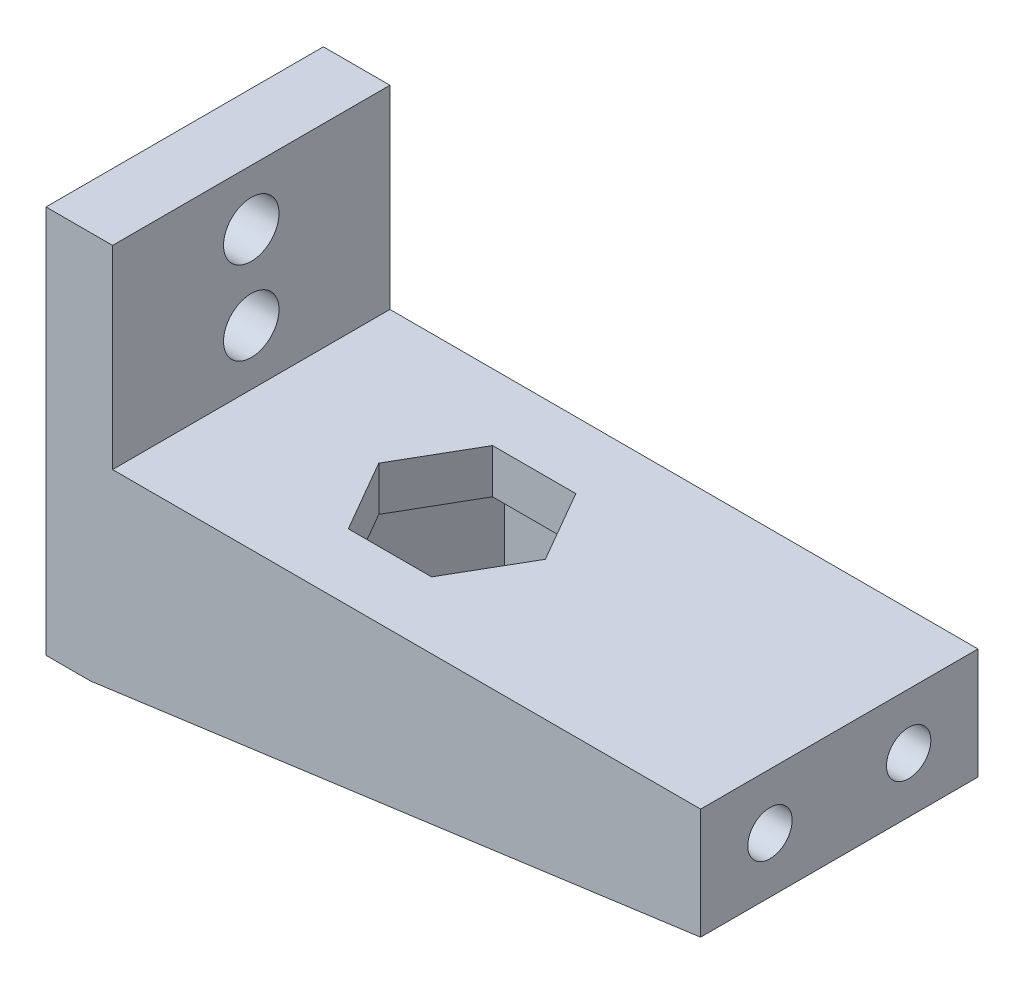
ISO-10303-21;
HEADER;
FILE_DESCRIPTION(('STEP AP214'),'2;1');
FILE_NAME('part.step','',(''),(''),'','','');
FILE_SCHEMA(('AUTOMOTIVE_DESIGN { 1 0 10303 214 1 1 1 1 }'));
ENDSEC;
DATA;
#1=APPLICATION_CONTEXT('core data for automotive mechanical design processes');
#2=APPLICATION_PROTOCOL_DEFINITION('international standard','automotive_design',2000,#1);
#3=PRODUCT_CONTEXT('',#1,'mechanical');
#4=PRODUCT('Part','Part','',(#3));
#5=PRODUCT_RELATED_PRODUCT_CATEGORY('part','',(#4));
#6=PRODUCT_DEFINITION_FORMATION('','',#4);
#7=PRODUCT_DEFINITION_CONTEXT('part definition',#1,'design');
#8=PRODUCT_DEFINITION('design','',#6,#7);
#9=PRODUCT_DEFINITION_SHAPE('','',#8);
#10=(LENGTH_UNIT() NAMED_UNIT(*) SI_UNIT(.MILLI.,.METRE.));
#11=(NAMED_UNIT(*) PLANE_ANGLE_UNIT() SI_UNIT($,.RADIAN.));
#12=(NAMED_UNIT(*) SI_UNIT($,.STERADIAN.) SOLID_ANGLE_UNIT());
#13=UNCERTAINTY_MEASURE_WITH_UNIT(LENGTH_MEASURE(1.E-05),#10,'distance_accuracy_value','');
#14=(GEOMETRIC_REPRESENTATION_CONTEXT(3) GLOBAL_UNCERTAINTY_ASSIGNED_CONTEXT((#13)) GLOBAL_UNIT_ASSIGNED_CONTEXT((#10,
#11,#12)) REPRESENTATION_CONTEXT('',''));
#15=CARTESIAN_POINT('',(0.,0.,0.));
#16=DIRECTION('',(0.,0.,1.));
#17=DIRECTION('',(1.,0.,0.));
#18=AXIS2_PLACEMENT_3D('',#15,#16,#17);
#19=CARTESIAN_POINT('',(4.,20.3125,8.17307692307693));
#20=DIRECTION('',(0.,0.,-1.));
#21=DIRECTION('',(0.,1.,0.));
#22=AXIS2_PLACEMENT_3D('',#19,#20,#21);
#23=PLANE('',#22);
#24=DIRECTION('',(-1.,0.,0.));
#25=VECTOR('',#24,1.);
#26=CARTESIAN_POINT('',(4.,-14.6875,8.17307692307692));
#27=LINE('',#26,#25);
#28=CARTESIAN_POINT('',(4.,-14.6875,8.17307692307693));
#29=VERTEX_POINT('',#28);
#30=CARTESIAN_POINT('',(0.,-14.6875,8.17307692307692));
#31=VERTEX_POINT('',#30);
#32=EDGE_CURVE('E319',#29,#31,#27,.T.);
#33=ORIENTED_EDGE('',*,*,#32,.F.);
#34=DIRECTION('',(0.990830168044299,0.135113204733314,0.));
#35=VECTOR('',#34,1.);
#36=CARTESIAN_POINT('',(4.,-14.6875,8.17307692307693));
#37=LINE('',#36,#35);
#38=CARTESIAN_POINT('',(59.,-7.1875,8.17307692307693));
#39=VERTEX_POINT('',#38);
#40=EDGE_CURVE('E246',#29,#39,#37,.T.);
#41=ORIENTED_EDGE('',*,*,#40,.T.);
#42=DIRECTION('',(0.,-1.,0.));
#43=VECTOR('',#42,1.);
#44=CARTESIAN_POINT('',(59.,2.8125,8.17307692307693));
#45=LINE('',#44,#43);
#46=CARTESIAN_POINT('',(59.,2.8125,8.17307692307693));
#47=VERTEX_POINT('',#46);
#48=EDGE_CURVE('E272',#47,#39,#45,.T.);
#49=ORIENTED_EDGE('',*,*,#48,.F.);
#50=DIRECTION('',(-1.,0.,0.));
#51=VECTOR('',#50,1.);
#52=CARTESIAN_POINT('',(59.,2.8125,8.17307692307693));
#53=LINE('',#52,#51);
#54=CARTESIAN_POINT('',(6.,2.8125,8.17307692307693));
#55=VERTEX_POINT('',#54);
#56=EDGE_CURVE('E282',#47,#55,#53,.T.);
#57=ORIENTED_EDGE('',*,*,#56,.T.);
#58=DIRECTION('',(0.,-1.,0.));
#59=VECTOR('',#58,1.);
#60=CARTESIAN_POINT('',(6.,20.3125,8.17307692307693));
#61=LINE('',#60,#59);
#62=CARTESIAN_POINT('',(6.,20.3125,8.17307692307693));
#63=VERTEX_POINT('',#62);
#64=EDGE_CURVE('E287',#63,#55,#61,.T.);
#65=ORIENTED_EDGE('',*,*,#64,.F.);
#66=DIRECTION('',(-1.,0.,0.));
#67=VECTOR('',#66,1.);
#68=CARTESIAN_POINT('',(4.,20.3125,8.17307692307693));
#69=LINE('',#68,#67);
#70=CARTESIAN_POINT('',(0.,20.3125,8.17307692307693));
#71=VERTEX_POINT('',#70);
#72=EDGE_CURVE('E302',#63,#71,#69,.T.);
#73=ORIENTED_EDGE('',*,*,#72,.T.);
#74=DIRECTION('',(0.,-1.,0.));
#75=VECTOR('',#74,1.);
#76=CARTESIAN_POINT('',(0.,20.3125,8.17307692307693));
#77=LINE('',#76,#75);
#78=EDGE_CURVE('E299',#71,#31,#77,.T.);
#79=ORIENTED_EDGE('',*,*,#78,.T.);
#80=EDGE_LOOP('',(#33,#41,#49,#57,#65,#73,#79));
#81=FACE_BOUND('',#80,.T.);
#82=ADVANCED_FACE('F32',(#81),#23,.F.);
#83=CARTESIAN_POINT('',(4.,-14.6875,8.17307692307692));
#84=DIRECTION('',(0.,1.,0.));
#85=DIRECTION('',(0.,0.,1.));
#86=AXIS2_PLACEMENT_3D('',#83,#84,#85);
#87=PLANE('',#86);
#88=DIRECTION('',(0.,0.,-1.));
#89=VECTOR('',#88,1.);
#90=CARTESIAN_POINT('',(0.,-14.6875,8.17307692307692));
#91=LINE('',#90,#89);
#92=CARTESIAN_POINT('',(0.,-14.6875,-16.8269230769231));
#93=VERTEX_POINT('',#92);
#94=EDGE_CURVE('E306',#31,#93,#91,.T.);
#95=ORIENTED_EDGE('',*,*,#94,.T.);
#96=DIRECTION('',(-1.,0.,0.));
#97=VECTOR('',#96,1.);
#98=CARTESIAN_POINT('',(4.,-14.6875,-16.8269230769231));
#99=LINE('',#98,#97);
#100=CARTESIAN_POINT('',(4.,-14.6875,-16.8269230769231));
#101=VERTEX_POINT('',#100);
#102=EDGE_CURVE('E316',#101,#93,#99,.T.);
#103=ORIENTED_EDGE('',*,*,#102,.F.);
#104=DIRECTION('',(0.,0.,-1.));
#105=VECTOR('',#104,1.);
#106=CARTESIAN_POINT('',(4.,-14.6875,8.17307692307692));
#107=LINE('',#106,#105);
#108=EDGE_CURVE('E300',#29,#101,#107,.T.);
#109=ORIENTED_EDGE('',*,*,#108,.F.);
#110=ORIENTED_EDGE('',*,*,#32,.T.);
#111=EDGE_LOOP('',(#95,#103,#109,#110));
#112=FACE_BOUND('',#111,.T.);
#113=ADVANCED_FACE('F356',(#112),#87,.F.);
#114=CARTESIAN_POINT('',(4.,20.3125,-16.8269230769231));
#115=DIRECTION('',(0.,0.,1.));
#116=DIRECTION('',(1.,0.,0.));
#117=AXIS2_PLACEMENT_3D('',#114,#115,#116);
#118=PLANE('',#117);
#119=DIRECTION('',(0.,1.,0.));
#120=VECTOR('',#119,1.);
#121=CARTESIAN_POINT('',(0.,20.3125,-16.8269230769231));
#122=LINE('',#121,#120);
#123=CARTESIAN_POINT('',(0.,20.3125,-16.8269230769231));
#124=VERTEX_POINT('',#123);
#125=EDGE_CURVE('E308',#93,#124,#122,.T.);
#126=ORIENTED_EDGE('',*,*,#125,.T.);
#127=DIRECTION('',(-1.,0.,0.));
#128=VECTOR('',#127,1.);
#129=CARTESIAN_POINT('',(4.,20.3125,-16.8269230769231));
#130=LINE('',#129,#128);
#131=CARTESIAN_POINT('',(6.,20.3125,-16.8269230769231));
#132=VERTEX_POINT('',#131);
#133=EDGE_CURVE('E313',#132,#124,#130,.T.);
#134=ORIENTED_EDGE('',*,*,#133,.F.);
#135=DIRECTION('',(0.,1.,0.));
#136=VECTOR('',#135,1.);
#137=CARTESIAN_POINT('',(6.,20.3125,-16.8269230769231));
#138=LINE('',#137,#136);
#139=CARTESIAN_POINT('',(6.,2.8125,-16.8269230769231));
#140=VERTEX_POINT('',#139);
#141=EDGE_CURVE('E293',#140,#132,#138,.T.);
#142=ORIENTED_EDGE('',*,*,#141,.F.);
#143=DIRECTION('',(-1.,0.,0.));
#144=VECTOR('',#143,1.);
#145=CARTESIAN_POINT('',(59.,2.8125,-16.8269230769231));
#146=LINE('',#145,#144);
#147=CARTESIAN_POINT('',(59.,2.8125,-16.8269230769231));
#148=VERTEX_POINT('',#147);
#149=EDGE_CURVE('E285',#148,#140,#146,.T.);
#150=ORIENTED_EDGE('',*,*,#149,.F.);
#151=DIRECTION('',(0.,1.,0.));
#152=VECTOR('',#151,1.);
#153=CARTESIAN_POINT('',(59.,2.8125,-16.8269230769231));
#154=LINE('',#153,#152);
#155=CARTESIAN_POINT('',(59.,-7.1875,-16.8269230769231));
#156=VERTEX_POINT('',#155);
#157=EDGE_CURVE('E278',#156,#148,#154,.T.);
#158=ORIENTED_EDGE('',*,*,#157,.F.);
#159=DIRECTION('',(0.990830168044299,0.135113204733314,0.));
#160=VECTOR('',#159,1.);
#161=CARTESIAN_POINT('',(4.,-14.6875,-16.8269230769231));
#162=LINE('',#161,#160);
#163=EDGE_CURVE('E256',#101,#156,#162,.T.);
#164=ORIENTED_EDGE('',*,*,#163,.F.);
#165=ORIENTED_EDGE('',*,*,#102,.T.);
#166=EDGE_LOOP('',(#126,#134,#142,#150,#158,#164,#165));
#167=FACE_BOUND('',#166,.T.);
#168=ADVANCED_FACE('F361',(#167),#118,.F.);
#169=CARTESIAN_POINT('',(4.,20.3125,8.17307692307693));
#170=DIRECTION('',(0.,-1.,0.));
#171=DIRECTION('',(0.,0.,-1.));
#172=AXIS2_PLACEMENT_3D('',#169,#170,#171);
#173=PLANE('',#172);
#174=DIRECTION('',(0.,0.,1.));
#175=VECTOR('',#174,1.);
#176=CARTESIAN_POINT('',(0.,20.3125,8.17307692307693));
#177=LINE('',#176,#175);
#178=EDGE_CURVE('E303',#124,#71,#177,.T.);
#179=ORIENTED_EDGE('',*,*,#178,.T.);
#180=ORIENTED_EDGE('',*,*,#72,.F.);
#181=DIRECTION('',(0.,0.,1.));
#182=VECTOR('',#181,1.);
#183=CARTESIAN_POINT('',(6.,20.3125,8.17307692307693));
#184=LINE('',#183,#182);
#185=EDGE_CURVE('E296',#132,#63,#184,.T.);
#186=ORIENTED_EDGE('',*,*,#185,.F.);
#187=ORIENTED_EDGE('',*,*,#133,.T.);
#188=EDGE_LOOP('',(#179,#180,#186,#187));
#189=FACE_BOUND('',#188,.T.);
#190=ADVANCED_FACE('F384',(#189),#173,.F.);
#191=CARTESIAN_POINT('',(0.,0.,0.));
#192=DIRECTION('',(1.,0.,0.));
#193=DIRECTION('',(0.,0.,-1.));
#194=AXIS2_PLACEMENT_3D('',#191,#192,#193);
#195=PLANE('',#194);
#196=CARTESIAN_POINT('',(0.,15.3125,-4.32692307692307));
#197=DIRECTION('',(1.,0.,0.));
#198=DIRECTION('',(0.,0.,-1.));
#199=AXIS2_PLACEMENT_3D('',#196,#197,#198);
#200=CIRCLE('',#199,2.5);
#201=CARTESIAN_POINT('',(0.,15.3125,-6.82692307692307));
#202=VERTEX_POINT('',#201);
#203=EDGE_CURVE('E269',#202,#202,#200,.T.);
#204=ORIENTED_EDGE('',*,*,#203,.T.);
#205=EDGE_LOOP('',(#204));
#206=FACE_BOUND('',#205,.T.);
#207=CARTESIAN_POINT('',(0.,7.8125,-4.32692307692307));
#208=DIRECTION('',(1.,0.,0.));
#209=DIRECTION('',(0.,0.,-1.));
#210=AXIS2_PLACEMENT_3D('',#207,#208,#209);
#211=CIRCLE('',#210,2.5);
#212=CARTESIAN_POINT('',(0.,7.8125,-6.82692307692307));
#213=VERTEX_POINT('',#212);
#214=EDGE_CURVE('E264',#213,#213,#211,.T.);
#215=ORIENTED_EDGE('',*,*,#214,.T.);
#216=EDGE_LOOP('',(#215));
#217=FACE_BOUND('',#216,.T.);
#218=ORIENTED_EDGE('',*,*,#78,.F.);
#219=ORIENTED_EDGE('',*,*,#178,.F.);
#220=ORIENTED_EDGE('',*,*,#125,.F.);
#221=ORIENTED_EDGE('',*,*,#94,.F.);
#222=EDGE_LOOP('',(#218,#219,#220,#221));
#223=FACE_BOUND('',#222,.T.);
#224=ADVANCED_FACE('F387',(#206,#217,#223),#195,.F.);
#225=CARTESIAN_POINT('',(6.,0.,0.));
#226=DIRECTION('',(1.,0.,0.));
#227=DIRECTION('',(0.,0.,-1.));
#228=AXIS2_PLACEMENT_3D('',#225,#226,#227);
#229=PLANE('',#228);
#230=CARTESIAN_POINT('',(6.,15.3125,-4.32692307692307));
#231=DIRECTION('',(1.,0.,0.));
#232=DIRECTION('',(0.,0.,-1.));
#233=AXIS2_PLACEMENT_3D('',#230,#231,#232);
#234=CIRCLE('',#233,2.5);
#235=CARTESIAN_POINT('',(6.,15.3125,-6.82692307692307));
#236=VERTEX_POINT('',#235);
#237=EDGE_CURVE('E261',#236,#236,#234,.T.);
#238=ORIENTED_EDGE('',*,*,#237,.F.);
#239=EDGE_LOOP('',(#238));
#240=FACE_BOUND('',#239,.T.);
#241=CARTESIAN_POINT('',(6.,7.8125,-4.32692307692307));
#242=DIRECTION('',(1.,0.,0.));
#243=DIRECTION('',(0.,0.,-1.));
#244=AXIS2_PLACEMENT_3D('',#241,#242,#243);
#245=CIRCLE('',#244,2.5);
#246=CARTESIAN_POINT('',(6.,7.8125,-6.82692307692307));
#247=VERTEX_POINT('',#246);
#248=EDGE_CURVE('E258',#247,#247,#245,.T.);
#249=ORIENTED_EDGE('',*,*,#248,.F.);
#250=EDGE_LOOP('',(#249));
#251=FACE_BOUND('',#250,.T.);
#252=ORIENTED_EDGE('',*,*,#64,.T.);
#253=DIRECTION('',(0.,0.,-1.));
#254=VECTOR('',#253,1.);
#255=CARTESIAN_POINT('',(6.,2.8125,8.17307692307693));
#256=LINE('',#255,#254);
#257=EDGE_CURVE('E290',#55,#140,#256,.T.);
#258=ORIENTED_EDGE('',*,*,#257,.T.);
#259=ORIENTED_EDGE('',*,*,#141,.T.);
#260=ORIENTED_EDGE('',*,*,#185,.T.);
#261=EDGE_LOOP('',(#252,#258,#259,#260));
#262=FACE_BOUND('',#261,.T.);
#263=ADVANCED_FACE('F381',(#240,#251,#262),#229,.T.);
#264=CARTESIAN_POINT('',(59.,2.8125,8.17307692307693));
#265=DIRECTION('',(0.,-1.,0.));
#266=DIRECTION('',(0.,0.,-1.));
#267=AXIS2_PLACEMENT_3D('',#264,#265,#266);
#268=PLANE('',#267);
#269=DIRECTION('',(-0.5,0.,-0.866025403784439));
#270=VECTOR('',#269,1.);
#271=CARTESIAN_POINT('',(32.5055534994651,2.8125,-4.32692307692308));
#272=LINE('',#271,#270);
#273=CARTESIAN_POINT('',(32.5055534994651,2.8125,-4.32692307692309));
#274=VERTEX_POINT('',#273);
#275=CARTESIAN_POINT('',(28.7527767497326,2.8125,-10.8269230769231));
#276=VERTEX_POINT('',#275);
#277=EDGE_CURVE('E230',#274,#276,#272,.T.);
#278=ORIENTED_EDGE('',*,*,#277,.F.);
#279=DIRECTION('',(0.5,0.,-0.866025403784439));
#280=VECTOR('',#279,1.);
#281=CARTESIAN_POINT('',(28.7527767497326,2.8125,2.17307692307693));
#282=LINE('',#281,#280);
#283=CARTESIAN_POINT('',(28.7527767497326,2.8125,2.17307692307693));
#284=VERTEX_POINT('',#283);
#285=EDGE_CURVE('E54',#284,#274,#282,.T.);
#286=ORIENTED_EDGE('',*,*,#285,.F.);
#287=DIRECTION('',(1.,0.,0.));
#288=VECTOR('',#287,1.);
#289=CARTESIAN_POINT('',(21.2472232502674,2.8125,2.17307692307693));
#290=LINE('',#289,#288);
#291=CARTESIAN_POINT('',(21.2472232502674,2.8125,2.17307692307693));
#292=VERTEX_POINT('',#291);
#293=EDGE_CURVE('E218',#292,#284,#290,.T.);
#294=ORIENTED_EDGE('',*,*,#293,.F.);
#295=DIRECTION('',(0.5,0.,0.866025403784439));
#296=VECTOR('',#295,1.);
#297=CARTESIAN_POINT('',(17.4944465005349,2.8125,-4.32692307692307));
#298=LINE('',#297,#296);
#299=CARTESIAN_POINT('',(17.4944465005349,2.8125,-4.32692307692307));
#300=VERTEX_POINT('',#299);
#301=EDGE_CURVE('E239',#300,#292,#298,.T.);
#302=ORIENTED_EDGE('',*,*,#301,.F.);
#303=DIRECTION('',(-0.5,0.,0.866025403784438));
#304=VECTOR('',#303,1.);
#305=CARTESIAN_POINT('',(21.2472232502674,2.8125,-10.8269230769231));
#306=LINE('',#305,#304);
#307=CARTESIAN_POINT('',(21.2472232502674,2.8125,-10.8269230769231));
#308=VERTEX_POINT('',#307);
#309=EDGE_CURVE('E236',#308,#300,#306,.T.);
#310=ORIENTED_EDGE('',*,*,#309,.F.);
#311=DIRECTION('',(-1.,0.,0.));
#312=VECTOR('',#311,1.);
#313=CARTESIAN_POINT('',(28.7527767497326,2.8125,-10.8269230769231));
#314=LINE('',#313,#312);
#315=EDGE_CURVE('E233',#276,#308,#314,.T.);
#316=ORIENTED_EDGE('',*,*,#315,.F.);
#317=EDGE_LOOP('',(#278,#286,#294,#302,#310,#316));
#318=FACE_BOUND('',#317,.T.);
#319=ORIENTED_EDGE('',*,*,#257,.F.);
#320=ORIENTED_EDGE('',*,*,#56,.F.);
#321=DIRECTION('',(0.,0.,1.));
#322=VECTOR('',#321,1.);
#323=CARTESIAN_POINT('',(59.,2.8125,8.17307692307693));
#324=LINE('',#323,#322);
#325=EDGE_CURVE('E280',#148,#47,#324,.T.);
#326=ORIENTED_EDGE('',*,*,#325,.F.);
#327=ORIENTED_EDGE('',*,*,#149,.T.);
#328=EDGE_LOOP('',(#319,#320,#326,#327));
#329=FACE_BOUND('',#328,.T.);
#330=ADVANCED_FACE('F395',(#318,#329),#268,.F.);
#331=CARTESIAN_POINT('',(59.,0.,0.));
#332=DIRECTION('',(1.,0.,0.));
#333=DIRECTION('',(0.,0.,-1.));
#334=AXIS2_PLACEMENT_3D('',#331,#332,#333);
#335=PLANE('',#334);
#336=CARTESIAN_POINT('',(59.,-2.1875,1.92307692307692));
#337=DIRECTION('',(1.,0.,0.));
#338=DIRECTION('',(0.,0.,-1.));
#339=AXIS2_PLACEMENT_3D('',#336,#337,#338);
#340=CIRCLE('',#339,2.);
#341=CARTESIAN_POINT('',(59.,-2.1875,-0.0769230769230751));
#342=VERTEX_POINT('',#341);
#343=EDGE_CURVE('E207',#342,#342,#340,.T.);
#344=ORIENTED_EDGE('',*,*,#343,.F.);
#345=EDGE_LOOP('',(#344));
#346=FACE_BOUND('',#345,.T.);
#347=CARTESIAN_POINT('',(59.,-2.1875,-10.5769230769231));
#348=DIRECTION('',(1.,0.,0.));
#349=DIRECTION('',(0.,0.,-1.));
#350=AXIS2_PLACEMENT_3D('',#347,#348,#349);
#351=CIRCLE('',#350,2.);
#352=CARTESIAN_POINT('',(59.,-2.1875,-12.5769230769231));
#353=VERTEX_POINT('',#352);
#354=EDGE_CURVE('E196',#353,#353,#351,.T.);
#355=ORIENTED_EDGE('',*,*,#354,.F.);
#356=EDGE_LOOP('',(#355));
#357=FACE_BOUND('',#356,.T.);
#358=ORIENTED_EDGE('',*,*,#48,.T.);
#359=DIRECTION('',(0.,0.,-1.));
#360=VECTOR('',#359,1.);
#361=CARTESIAN_POINT('',(59.,-7.1875,8.17307692307693));
#362=LINE('',#361,#360);
#363=EDGE_CURVE('E275',#39,#156,#362,.T.);
#364=ORIENTED_EDGE('',*,*,#363,.T.);
#365=ORIENTED_EDGE('',*,*,#157,.T.);
#366=ORIENTED_EDGE('',*,*,#325,.T.);
#367=EDGE_LOOP('',(#358,#364,#365,#366));
#368=FACE_BOUND('',#367,.T.);
#369=ADVANCED_FACE('F376',(#346,#357,#368),#335,.T.);
#370=CARTESIAN_POINT('',(-49.,7.8125,-4.32692307692307));
#371=DIRECTION('',(1.,0.,0.));
#372=DIRECTION('',(0.,0.,-1.));
#373=AXIS2_PLACEMENT_3D('',#370,#371,#372);
#374=CYLINDRICAL_SURFACE('',#373,2.5);
#375=ORIENTED_EDGE('',*,*,#248,.T.);
#376=EDGE_LOOP('',(#375));
#377=FACE_BOUND('',#376,.T.);
#378=ORIENTED_EDGE('',*,*,#214,.F.);
#379=EDGE_LOOP('',(#378));
#380=FACE_BOUND('',#379,.T.);
#381=ADVANCED_FACE('F432',(#377,#380),#374,.F.);
#382=CARTESIAN_POINT('',(-49.,15.3125,-4.32692307692307));
#383=DIRECTION('',(1.,0.,0.));
#384=DIRECTION('',(0.,0.,-1.));
#385=AXIS2_PLACEMENT_3D('',#382,#383,#384);
#386=CYLINDRICAL_SURFACE('',#385,2.5);
#387=ORIENTED_EDGE('',*,*,#237,.T.);
#388=EDGE_LOOP('',(#387));
#389=FACE_BOUND('',#388,.T.);
#390=ORIENTED_EDGE('',*,*,#203,.F.);
#391=EDGE_LOOP('',(#390));
#392=FACE_BOUND('',#391,.T.);
#393=ADVANCED_FACE('F437',(#389,#392),#386,.F.);
#394=CARTESIAN_POINT('',(4.,-14.6875,-16.8269230769231));
#395=DIRECTION('',(0.135113204733314,-0.990830168044299,0.));
#396=DIRECTION('',(0.990830168044299,0.135113204733314,0.));
#397=AXIS2_PLACEMENT_3D('',#394,#395,#396);
#398=PLANE('',#397);
#399=DIRECTION('',(0.49884184634077,0.0680238881373777,0.864019422803681));
#400=VECTOR('',#399,1.);
#401=CARTESIAN_POINT('',(22.1338723742525,-12.2146992216928,-27.4912017456946));
#402=LINE('',#401,#400);
#403=CARTESIAN_POINT('',(30.2538874496256,-11.1074244386874,-13.4269230769231));
#404=VERTEX_POINT('',#403);
#405=CARTESIAN_POINT('',(35.5077748992512,-10.3909852410112,-4.32692307692308));
#406=VERTEX_POINT('',#405);
#407=EDGE_CURVE('E11',#404,#406,#402,.T.);
#408=ORIENTED_EDGE('',*,*,#407,.F.);
#409=DIRECTION('',(0.990830168044299,0.135113204733314,0.));
#410=VECTOR('',#409,1.);
#411=CARTESIAN_POINT('',(4.,-14.6875,-13.4269230769231));
#412=LINE('',#411,#410);
#413=CARTESIAN_POINT('',(19.7461125503744,-12.5403028340399,-13.4269230769231));
#414=VERTEX_POINT('',#413);
#415=EDGE_CURVE('E165',#414,#404,#412,.T.);
#416=ORIENTED_EDGE('',*,*,#415,.F.);
#417=DIRECTION('',(0.49884184634077,0.0680238881373778,-0.86401942280368));
#418=VECTOR('',#417,1.);
#419=CARTESIAN_POINT('',(17.2203692709918,-12.8847223721375,-9.0522073901567));
#420=LINE('',#419,#418);
#421=CARTESIAN_POINT('',(14.4922251007488,-13.2567420317161,-4.32692307692308));
#422=VERTEX_POINT('',#421);
#423=EDGE_CURVE('E323',#422,#414,#420,.T.);
#424=ORIENTED_EDGE('',*,*,#423,.F.);
#425=DIRECTION('',(-0.49884184634077,-0.0680238881373777,-0.864019422803681));
#426=VECTOR('',#425,1.);
#427=CARTESIAN_POINT('',(6.44514316734992,-14.3540713862705,-18.2648778382396));
#428=LINE('',#427,#426);
#429=CARTESIAN_POINT('',(19.7461125503744,-12.5403028340399,4.77307692307692));
#430=VERTEX_POINT('',#429);
#431=EDGE_CURVE('E325',#430,#422,#428,.T.);
#432=ORIENTED_EDGE('',*,*,#431,.F.);
#433=DIRECTION('',(-0.990830168044299,-0.135113204733314,0.));
#434=VECTOR('',#433,1.);
#435=CARTESIAN_POINT('',(4.,-14.6875,4.77307692307692));
#436=LINE('',#435,#434);
#437=CARTESIAN_POINT('',(30.2538874496256,-11.1074244386874,4.77307692307692));
#438=VERTEX_POINT('',#437);
#439=EDGE_CURVE('E327',#438,#430,#436,.T.);
#440=ORIENTED_EDGE('',*,*,#439,.F.);
#441=DIRECTION('',(-0.49884184634077,-0.0680238881373777,0.86401942280368));
#442=VECTOR('',#441,1.);
#443=CARTESIAN_POINT('',(32.9090984778943,-10.7453502075599,0.174116517298303));
#444=LINE('',#443,#442);
#445=EDGE_CURVE('E39',#406,#438,#444,.T.);
#446=ORIENTED_EDGE('',*,*,#445,.F.);
#447=EDGE_LOOP('',(#408,#416,#424,#432,#440,#446));
#448=FACE_BOUND('',#447,.T.);
#449=ORIENTED_EDGE('',*,*,#40,.F.);
#450=ORIENTED_EDGE('',*,*,#108,.T.);
#451=ORIENTED_EDGE('',*,*,#163,.T.);
#452=ORIENTED_EDGE('',*,*,#363,.F.);
#453=EDGE_LOOP('',(#449,#450,#451,#452));
#454=FACE_BOUND('',#453,.T.);
#455=ADVANCED_FACE('F339',(#448,#454),#398,.T.);
#456=CARTESIAN_POINT('',(28.7527767497326,-1.1875,2.17307692307693));
#457=DIRECTION('',(0.866025403784439,0.,0.5));
#458=DIRECTION('',(0.5,0.,-0.866025403784439));
#459=AXIS2_PLACEMENT_3D('',#456,#457,#458);
#460=PLANE('',#459);
#461=ORIENTED_EDGE('',*,*,#285,.T.);
#462=DIRECTION('',(0.,1.,0.));
#463=VECTOR('',#462,1.);
#464=CARTESIAN_POINT('',(32.5055534994651,-1.1875,-4.32692307692308));
#465=LINE('',#464,#463);
#466=CARTESIAN_POINT('',(32.5055534994651,-1.1875,-4.32692307692308));
#467=VERTEX_POINT('',#466);
#468=EDGE_CURVE('E228',#467,#274,#465,.T.);
#469=ORIENTED_EDGE('',*,*,#468,.F.);
#470=DIRECTION('',(0.5,0.,-0.866025403784439));
#471=VECTOR('',#470,1.);
#472=CARTESIAN_POINT('',(28.7527767497326,-1.1875,2.17307692307693));
#473=LINE('',#472,#471);
#474=CARTESIAN_POINT('',(28.7527767497326,-1.1875,2.17307692307693));
#475=VERTEX_POINT('',#474);
#476=EDGE_CURVE('E215',#475,#467,#473,.T.);
#477=ORIENTED_EDGE('',*,*,#476,.F.);
#478=DIRECTION('',(0.,1.,0.));
#479=VECTOR('',#478,1.);
#480=CARTESIAN_POINT('',(28.7527767497326,-1.1875,2.17307692307693));
#481=LINE('',#480,#479);
#482=EDGE_CURVE('E244',#475,#284,#481,.T.);
#483=ORIENTED_EDGE('',*,*,#482,.T.);
#484=EDGE_LOOP('',(#461,#469,#477,#483));
#485=FACE_BOUND('',#484,.T.);
#486=ADVANCED_FACE('F542',(#485),#460,.F.);
#487=CARTESIAN_POINT('',(21.2472232502674,-1.1875,2.17307692307693));
#488=DIRECTION('',(0.,0.,1.));
#489=DIRECTION('',(1.,0.,0.));
#490=AXIS2_PLACEMENT_3D('',#487,#488,#489);
#491=PLANE('',#490);
#492=ORIENTED_EDGE('',*,*,#293,.T.);
#493=ORIENTED_EDGE('',*,*,#482,.F.);
#494=DIRECTION('',(1.,0.,0.));
#495=VECTOR('',#494,1.);
#496=CARTESIAN_POINT('',(21.2472232502674,-1.1875,2.17307692307693));
#497=LINE('',#496,#495);
#498=CARTESIAN_POINT('',(21.2472232502674,-1.1875,2.17307692307693));
#499=VERTEX_POINT('',#498);
#500=EDGE_CURVE('E226',#499,#475,#497,.T.);
#501=ORIENTED_EDGE('',*,*,#500,.F.);
#502=DIRECTION('',(0.,1.,0.));
#503=VECTOR('',#502,1.);
#504=CARTESIAN_POINT('',(21.2472232502674,-1.1875,2.17307692307693));
#505=LINE('',#504,#503);
#506=EDGE_CURVE('E247',#499,#292,#505,.T.);
#507=ORIENTED_EDGE('',*,*,#506,.T.);
#508=EDGE_LOOP('',(#492,#493,#501,#507));
#509=FACE_BOUND('',#508,.T.);
#510=ADVANCED_FACE('F551',(#509),#491,.F.);
#511=CARTESIAN_POINT('',(17.4944465005349,-1.1875,-4.32692307692307));
#512=DIRECTION('',(-0.866025403784439,0.,0.5));
#513=DIRECTION('',(0.5,0.,0.866025403784439));
#514=AXIS2_PLACEMENT_3D('',#511,#512,#513);
#515=PLANE('',#514);
#516=ORIENTED_EDGE('',*,*,#301,.T.);
#517=ORIENTED_EDGE('',*,*,#506,.F.);
#518=DIRECTION('',(0.5,0.,0.866025403784439));
#519=VECTOR('',#518,1.);
#520=CARTESIAN_POINT('',(17.4944465005349,-1.1875,-4.32692307692307));
#521=LINE('',#520,#519);
#522=CARTESIAN_POINT('',(17.4944465005349,-1.1875,-4.32692307692307));
#523=VERTEX_POINT('',#522);
#524=EDGE_CURVE('E224',#523,#499,#521,.T.);
#525=ORIENTED_EDGE('',*,*,#524,.F.);
#526=DIRECTION('',(0.,1.,0.));
#527=VECTOR('',#526,1.);
#528=CARTESIAN_POINT('',(17.4944465005349,-1.1875,-4.32692307692307));
#529=LINE('',#528,#527);
#530=EDGE_CURVE('E249',#523,#300,#529,.T.);
#531=ORIENTED_EDGE('',*,*,#530,.T.);
#532=EDGE_LOOP('',(#516,#517,#525,#531));
#533=FACE_BOUND('',#532,.T.);
#534=ADVANCED_FACE('F560',(#533),#515,.F.);
#535=CARTESIAN_POINT('',(21.2472232502674,-1.1875,-10.8269230769231));
#536=DIRECTION('',(-0.866025403784439,0.,-0.5));
#537=DIRECTION('',(-0.5,0.,0.866025403784439));
#538=AXIS2_PLACEMENT_3D('',#535,#536,#537);
#539=PLANE('',#538);
#540=ORIENTED_EDGE('',*,*,#309,.T.);
#541=ORIENTED_EDGE('',*,*,#530,.F.);
#542=DIRECTION('',(-0.5,0.,0.866025403784438));
#543=VECTOR('',#542,1.);
#544=CARTESIAN_POINT('',(21.2472232502674,-1.1875,-10.8269230769231));
#545=LINE('',#544,#543);
#546=CARTESIAN_POINT('',(21.2472232502674,-1.1875,-10.8269230769231));
#547=VERTEX_POINT('',#546);
#548=EDGE_CURVE('E222',#547,#523,#545,.T.);
#549=ORIENTED_EDGE('',*,*,#548,.F.);
#550=DIRECTION('',(0.,1.,0.));
#551=VECTOR('',#550,1.);
#552=CARTESIAN_POINT('',(21.2472232502674,-1.1875,-10.8269230769231));
#553=LINE('',#552,#551);
#554=EDGE_CURVE('E251',#547,#308,#553,.T.);
#555=ORIENTED_EDGE('',*,*,#554,.T.);
#556=EDGE_LOOP('',(#540,#541,#549,#555));
#557=FACE_BOUND('',#556,.T.);
#558=ADVANCED_FACE('F570',(#557),#539,.F.);
#559=CARTESIAN_POINT('',(28.7527767497326,-1.1875,-10.8269230769231));
#560=DIRECTION('',(0.,0.,-1.));
#561=DIRECTION('',(-1.,0.,0.));
#562=AXIS2_PLACEMENT_3D('',#559,#560,#561);
#563=PLANE('',#562);
#564=ORIENTED_EDGE('',*,*,#315,.T.);
#565=ORIENTED_EDGE('',*,*,#554,.F.);
#566=DIRECTION('',(-1.,0.,0.));
#567=VECTOR('',#566,1.);
#568=CARTESIAN_POINT('',(28.7527767497326,-1.1875,-10.8269230769231));
#569=LINE('',#568,#567);
#570=CARTESIAN_POINT('',(28.7527767497326,-1.1875,-10.8269230769231));
#571=VERTEX_POINT('',#570);
#572=EDGE_CURVE('E220',#571,#547,#569,.T.);
#573=ORIENTED_EDGE('',*,*,#572,.F.);
#574=DIRECTION('',(0.,1.,0.));
#575=VECTOR('',#574,1.);
#576=CARTESIAN_POINT('',(28.7527767497326,-1.1875,-10.8269230769231));
#577=LINE('',#576,#575);
#578=EDGE_CURVE('E253',#571,#276,#577,.T.);
#579=ORIENTED_EDGE('',*,*,#578,.T.);
#580=EDGE_LOOP('',(#564,#565,#573,#579));
#581=FACE_BOUND('',#580,.T.);
#582=ADVANCED_FACE('F580',(#581),#563,.F.);
#583=CARTESIAN_POINT('',(32.5055534994651,-1.1875,-4.32692307692308));
#584=DIRECTION('',(0.866025403784439,0.,-0.5));
#585=DIRECTION('',(-0.5,0.,-0.866025403784439));
#586=AXIS2_PLACEMENT_3D('',#583,#584,#585);
#587=PLANE('',#586);
#588=ORIENTED_EDGE('',*,*,#277,.T.);
#589=ORIENTED_EDGE('',*,*,#578,.F.);
#590=DIRECTION('',(-0.5,0.,-0.866025403784439));
#591=VECTOR('',#590,1.);
#592=CARTESIAN_POINT('',(32.5055534994651,-1.1875,-4.32692307692308));
#593=LINE('',#592,#591);
#594=EDGE_CURVE('E217',#467,#571,#593,.T.);
#595=ORIENTED_EDGE('',*,*,#594,.F.);
#596=ORIENTED_EDGE('',*,*,#468,.T.);
#597=EDGE_LOOP('',(#588,#589,#595,#596));
#598=FACE_BOUND('',#597,.T.);
#599=ADVANCED_FACE('F501',(#598),#587,.F.);
#600=CARTESIAN_POINT('',(39.,-2.1875,-10.5769230769231));
#601=DIRECTION('',(1.,0.,0.));
#602=DIRECTION('',(0.,0.,-1.));
#603=AXIS2_PLACEMENT_3D('',#600,#601,#602);
#604=CYLINDRICAL_SURFACE('',#603,2.);
#605=CARTESIAN_POINT('',(39.,-2.1875,-10.5769230769231));
#606=DIRECTION('',(1.,0.,0.));
#607=DIRECTION('',(0.,0.,-1.));
#608=AXIS2_PLACEMENT_3D('',#605,#606,#607);
#609=CIRCLE('',#608,2.);
#610=CARTESIAN_POINT('',(39.,-2.1875,-12.5769230769231));
#611=VERTEX_POINT('',#610);
#612=EDGE_CURVE('E210',#611,#611,#609,.T.);
#613=ORIENTED_EDGE('',*,*,#612,.F.);
#614=EDGE_LOOP('',(#613));
#615=FACE_BOUND('',#614,.T.);
#616=ORIENTED_EDGE('',*,*,#354,.T.);
#617=EDGE_LOOP('',(#616));
#618=FACE_BOUND('',#617,.T.);
#619=ADVANCED_FACE('F495',(#615,#618),#604,.F.);
#620=CARTESIAN_POINT('',(39.,-2.1875,-10.5769230769231));
#621=DIRECTION('',(1.,0.,0.));
#622=DIRECTION('',(0.,0.,-1.));
#623=AXIS2_PLACEMENT_3D('',#620,#621,#622);
#624=PLANE('',#623);
#625=ORIENTED_EDGE('',*,*,#612,.T.);
#626=EDGE_LOOP('',(#625));
#627=FACE_BOUND('',#626,.T.);
#628=ADVANCED_FACE('F500',(#627),#624,.T.);
#629=CARTESIAN_POINT('',(39.,-2.1875,1.92307692307692));
#630=DIRECTION('',(1.,0.,0.));
#631=DIRECTION('',(0.,0.,-1.));
#632=AXIS2_PLACEMENT_3D('',#629,#630,#631);
#633=CYLINDRICAL_SURFACE('',#632,2.);
#634=CARTESIAN_POINT('',(39.,-2.1875,1.92307692307692));
#635=DIRECTION('',(1.,0.,0.));
#636=DIRECTION('',(0.,0.,-1.));
#637=AXIS2_PLACEMENT_3D('',#634,#635,#636);
#638=CIRCLE('',#637,2.);
#639=CARTESIAN_POINT('',(39.,-2.1875,-0.0769230769230751));
#640=VERTEX_POINT('',#639);
#641=EDGE_CURVE('E204',#640,#640,#638,.T.);
#642=ORIENTED_EDGE('',*,*,#641,.F.);
#643=EDGE_LOOP('',(#642));
#644=FACE_BOUND('',#643,.T.);
#645=ORIENTED_EDGE('',*,*,#343,.T.);
#646=EDGE_LOOP('',(#645));
#647=FACE_BOUND('',#646,.T.);
#648=ADVANCED_FACE('F513',(#644,#647),#633,.F.);
#649=CARTESIAN_POINT('',(39.,-2.1875,1.92307692307692));
#650=DIRECTION('',(1.,0.,0.));
#651=DIRECTION('',(0.,0.,-1.));
#652=AXIS2_PLACEMENT_3D('',#649,#650,#651);
#653=PLANE('',#652);
#654=ORIENTED_EDGE('',*,*,#641,.T.);
#655=EDGE_LOOP('',(#654));
#656=FACE_BOUND('',#655,.T.);
#657=ADVANCED_FACE('F523',(#656),#653,.T.);
#658=CARTESIAN_POINT('',(35.5077748992512,-46.1875,-4.32692307692308));
#659=DIRECTION('',(0.866025403784439,0.,-0.5));
#660=DIRECTION('',(-0.5,0.,-0.866025403784439));
#661=AXIS2_PLACEMENT_3D('',#658,#659,#660);
#662=PLANE('',#661);
#663=ORIENTED_EDGE('',*,*,#407,.T.);
#664=DIRECTION('',(0.,1.,0.));
#665=VECTOR('',#664,1.);
#666=CARTESIAN_POINT('',(35.5077748992512,-46.1875,-4.32692307692308));
#667=LINE('',#666,#665);
#668=CARTESIAN_POINT('',(35.5077748992512,-1.1875,-4.32692307692308));
#669=VERTEX_POINT('',#668);
#670=EDGE_CURVE('E184',#406,#669,#667,.T.);
#671=ORIENTED_EDGE('',*,*,#670,.T.);
#672=DIRECTION('',(-0.5,0.,-0.866025403784439));
#673=VECTOR('',#672,1.);
#674=CARTESIAN_POINT('',(35.5077748992512,-1.1875,-4.32692307692308));
#675=LINE('',#674,#673);
#676=CARTESIAN_POINT('',(30.2538874496256,-1.1875,-13.4269230769231));
#677=VERTEX_POINT('',#676);
#678=EDGE_CURVE('E176',#669,#677,#675,.T.);
#679=ORIENTED_EDGE('',*,*,#678,.T.);
#680=DIRECTION('',(0.,1.,0.));
#681=VECTOR('',#680,1.);
#682=CARTESIAN_POINT('',(30.2538874496256,-46.1875,-13.4269230769231));
#683=LINE('',#682,#681);
#684=EDGE_CURVE('E160',#404,#677,#683,.T.);
#685=ORIENTED_EDGE('',*,*,#684,.F.);
#686=EDGE_LOOP('',(#663,#671,#679,#685));
#687=FACE_BOUND('',#686,.T.);
#688=ADVANCED_FACE('F182',(#687),#662,.F.);
#689=CARTESIAN_POINT('',(30.2538874496256,-46.1875,4.77307692307692));
#690=DIRECTION('',(0.866025403784439,0.,0.5));
#691=DIRECTION('',(0.5,0.,-0.866025403784439));
#692=AXIS2_PLACEMENT_3D('',#689,#690,#691);
#693=PLANE('',#692);
#694=ORIENTED_EDGE('',*,*,#445,.T.);
#695=DIRECTION('',(0.,1.,0.));
#696=VECTOR('',#695,1.);
#697=CARTESIAN_POINT('',(30.2538874496256,-46.1875,4.77307692307692));
#698=LINE('',#697,#696);
#699=CARTESIAN_POINT('',(30.2538874496256,-1.1875,4.77307692307692));
#700=VERTEX_POINT('',#699);
#701=EDGE_CURVE('E197',#438,#700,#698,.T.);
#702=ORIENTED_EDGE('',*,*,#701,.T.);
#703=DIRECTION('',(0.5,0.,-0.866025403784439));
#704=VECTOR('',#703,1.);
#705=CARTESIAN_POINT('',(30.2538874496256,-1.1875,4.77307692307692));
#706=LINE('',#705,#704);
#707=EDGE_CURVE('E169',#700,#669,#706,.T.);
#708=ORIENTED_EDGE('',*,*,#707,.T.);
#709=ORIENTED_EDGE('',*,*,#670,.F.);
#710=EDGE_LOOP('',(#694,#702,#708,#709));
#711=FACE_BOUND('',#710,.T.);
#712=ADVANCED_FACE('F331',(#711),#693,.F.);
#713=CARTESIAN_POINT('',(19.7461125503744,-46.1875,4.77307692307692));
#714=DIRECTION('',(0.,0.,1.));
#715=DIRECTION('',(1.,0.,0.));
#716=AXIS2_PLACEMENT_3D('',#713,#714,#715);
#717=PLANE('',#716);
#718=ORIENTED_EDGE('',*,*,#439,.T.);
#719=DIRECTION('',(0.,1.,0.));
#720=VECTOR('',#719,1.);
#721=CARTESIAN_POINT('',(19.7461125503744,-46.1875,4.77307692307692));
#722=LINE('',#721,#720);
#723=CARTESIAN_POINT('',(19.7461125503744,-1.1875,4.77307692307692));
#724=VERTEX_POINT('',#723);
#725=EDGE_CURVE('E199',#430,#724,#722,.T.);
#726=ORIENTED_EDGE('',*,*,#725,.T.);
#727=DIRECTION('',(1.,0.,0.));
#728=VECTOR('',#727,1.);
#729=CARTESIAN_POINT('',(19.7461125503744,-1.1875,4.77307692307692));
#730=LINE('',#729,#728);
#731=EDGE_CURVE('E191',#724,#700,#730,.T.);
#732=ORIENTED_EDGE('',*,*,#731,.T.);
#733=ORIENTED_EDGE('',*,*,#701,.F.);
#734=EDGE_LOOP('',(#718,#726,#732,#733));
#735=FACE_BOUND('',#734,.T.);
#736=ADVANCED_FACE('F335',(#735),#717,.F.);
#737=CARTESIAN_POINT('',(14.4922251007488,-46.1875,-4.32692307692308));
#738=DIRECTION('',(-0.866025403784439,0.,0.5));
#739=DIRECTION('',(0.5,0.,0.866025403784439));
#740=AXIS2_PLACEMENT_3D('',#737,#738,#739);
#741=PLANE('',#740);
#742=ORIENTED_EDGE('',*,*,#431,.T.);
#743=DIRECTION('',(0.,1.,0.));
#744=VECTOR('',#743,1.);
#745=CARTESIAN_POINT('',(14.4922251007488,-46.1875,-4.32692307692308));
#746=LINE('',#745,#744);
#747=CARTESIAN_POINT('',(14.4922251007488,-1.1875,-4.32692307692308));
#748=VERTEX_POINT('',#747);
#749=EDGE_CURVE('E201',#422,#748,#746,.T.);
#750=ORIENTED_EDGE('',*,*,#749,.T.);
#751=DIRECTION('',(0.5,0.,0.866025403784439));
#752=VECTOR('',#751,1.);
#753=CARTESIAN_POINT('',(14.4922251007488,-1.1875,-4.32692307692308));
#754=LINE('',#753,#752);
#755=EDGE_CURVE('E188',#748,#724,#754,.T.);
#756=ORIENTED_EDGE('',*,*,#755,.T.);
#757=ORIENTED_EDGE('',*,*,#725,.F.);
#758=EDGE_LOOP('',(#742,#750,#756,#757));
#759=FACE_BOUND('',#758,.T.);
#760=ADVANCED_FACE('F344',(#759),#741,.F.);
#761=CARTESIAN_POINT('',(19.7461125503744,-46.1875,-13.4269230769231));
#762=DIRECTION('',(-0.866025403784439,0.,-0.5));
#763=DIRECTION('',(-0.5,0.,0.866025403784439));
#764=AXIS2_PLACEMENT_3D('',#761,#762,#763);
#765=PLANE('',#764);
#766=ORIENTED_EDGE('',*,*,#423,.T.);
#767=DIRECTION('',(0.,1.,0.));
#768=VECTOR('',#767,1.);
#769=CARTESIAN_POINT('',(19.7461125503744,-46.1875,-13.4269230769231));
#770=LINE('',#769,#768);
#771=CARTESIAN_POINT('',(19.7461125503744,-1.1875,-13.4269230769231));
#772=VERTEX_POINT('',#771);
#773=EDGE_CURVE('E46',#414,#772,#770,.T.);
#774=ORIENTED_EDGE('',*,*,#773,.T.);
#775=DIRECTION('',(-0.5,0.,0.866025403784439));
#776=VECTOR('',#775,1.);
#777=CARTESIAN_POINT('',(19.7461125503744,-1.1875,-13.4269230769231));
#778=LINE('',#777,#776);
#779=EDGE_CURVE('E180',#772,#748,#778,.T.);
#780=ORIENTED_EDGE('',*,*,#779,.T.);
#781=ORIENTED_EDGE('',*,*,#749,.F.);
#782=EDGE_LOOP('',(#766,#774,#780,#781));
#783=FACE_BOUND('',#782,.T.);
#784=ADVANCED_FACE('F346',(#783),#765,.F.);
#785=CARTESIAN_POINT('',(30.2538874496256,-46.1875,-13.4269230769231));
#786=DIRECTION('',(0.,0.,-1.));
#787=DIRECTION('',(-1.,0.,0.));
#788=AXIS2_PLACEMENT_3D('',#785,#786,#787);
#789=PLANE('',#788);
#790=ORIENTED_EDGE('',*,*,#415,.T.);
#791=ORIENTED_EDGE('',*,*,#684,.T.);
#792=DIRECTION('',(-1.,0.,0.));
#793=VECTOR('',#792,1.);
#794=CARTESIAN_POINT('',(30.2538874496256,-1.1875,-13.4269230769231));
#795=LINE('',#794,#793);
#796=EDGE_CURVE('E163',#677,#772,#795,.T.);
#797=ORIENTED_EDGE('',*,*,#796,.T.);
#798=ORIENTED_EDGE('',*,*,#773,.F.);
#799=EDGE_LOOP('',(#790,#791,#797,#798));
#800=FACE_BOUND('',#799,.T.);
#801=ADVANCED_FACE('F162',(#800),#789,.F.);
#802=CARTESIAN_POINT('',(0.,-1.1875,0.));
#803=DIRECTION('',(0.,1.,0.));
#804=DIRECTION('',(0.,0.,1.));
#805=AXIS2_PLACEMENT_3D('',#802,#803,#804);
#806=PLANE('',#805);
#807=ORIENTED_EDGE('',*,*,#476,.T.);
#808=ORIENTED_EDGE('',*,*,#594,.T.);
#809=ORIENTED_EDGE('',*,*,#572,.T.);
#810=ORIENTED_EDGE('',*,*,#548,.T.);
#811=ORIENTED_EDGE('',*,*,#524,.T.);
#812=ORIENTED_EDGE('',*,*,#500,.T.);
#813=EDGE_LOOP('',(#807,#808,#809,#810,#811,#812));
#814=FACE_BOUND('',#813,.T.);
#815=ORIENTED_EDGE('',*,*,#678,.F.);
#816=ORIENTED_EDGE('',*,*,#707,.F.);
#817=ORIENTED_EDGE('',*,*,#731,.F.);
#818=ORIENTED_EDGE('',*,*,#755,.F.);
#819=ORIENTED_EDGE('',*,*,#779,.F.);
#820=ORIENTED_EDGE('',*,*,#796,.F.);
#821=EDGE_LOOP('',(#815,#816,#817,#818,#819,#820));
#822=FACE_BOUND('',#821,.T.);
#823=ADVANCED_FACE('F174',(#814,#822),#806,.F.);
#824=CLOSED_SHELL('',(#82,#113,#168,#190,#224,#263,#330,#369,#381,#393,#455,#486,#510,#534,#558,
#582,#599,#619,#628,#648,#657,#688,#712,#736,#760,#784,#801,#823));
#825=MANIFOLD_SOLID_BREP('B2',#824);
#826=ADVANCED_BREP_SHAPE_REPRESENTATION('',(#18,#825),#14);
#827=SHAPE_DEFINITION_REPRESENTATION(#9,#826);
ENDSEC;
END-ISO-10303-21;
